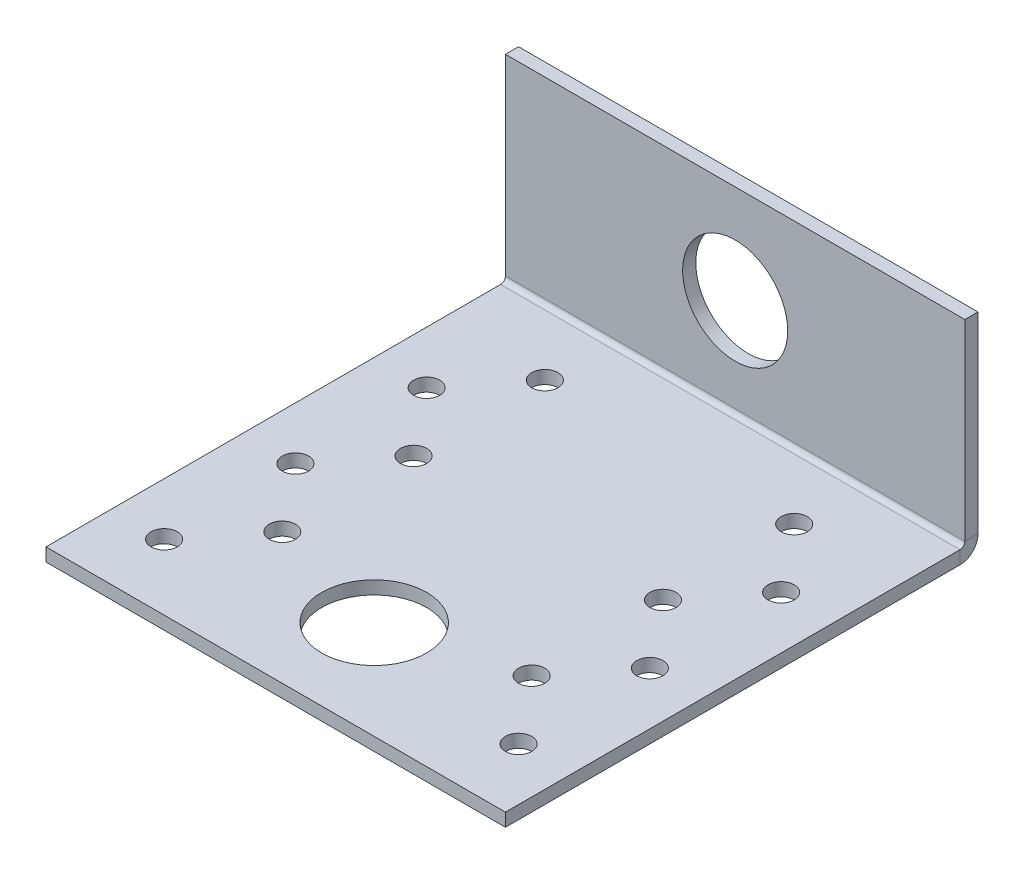
ISO-10303-21;
HEADER;
FILE_DESCRIPTION(('STEP AP214'),'2;1');
FILE_NAME('part.step','',(''),(''),'','','');
FILE_SCHEMA(('AUTOMOTIVE_DESIGN { 1 0 10303 214 1 1 1 1 }'));
ENDSEC;
DATA;
#1=APPLICATION_CONTEXT('core data for automotive mechanical design processes');
#2=APPLICATION_PROTOCOL_DEFINITION('international standard','automotive_design',2000,#1);
#3=PRODUCT_CONTEXT('',#1,'mechanical');
#4=PRODUCT('Part','Part','',(#3));
#5=PRODUCT_RELATED_PRODUCT_CATEGORY('part','',(#4));
#6=PRODUCT_DEFINITION_FORMATION('','',#4);
#7=PRODUCT_DEFINITION_CONTEXT('part definition',#1,'design');
#8=PRODUCT_DEFINITION('design','',#6,#7);
#9=PRODUCT_DEFINITION_SHAPE('','',#8);
#10=(LENGTH_UNIT() NAMED_UNIT(*) SI_UNIT(.MILLI.,.METRE.));
#11=(NAMED_UNIT(*) PLANE_ANGLE_UNIT() SI_UNIT($,.RADIAN.));
#12=(NAMED_UNIT(*) SI_UNIT($,.STERADIAN.) SOLID_ANGLE_UNIT());
#13=UNCERTAINTY_MEASURE_WITH_UNIT(LENGTH_MEASURE(1.E-05),#10,'distance_accuracy_value','');
#14=(GEOMETRIC_REPRESENTATION_CONTEXT(3) GLOBAL_UNCERTAINTY_ASSIGNED_CONTEXT((#13)) GLOBAL_UNIT_ASSIGNED_CONTEXT((#10,
#11,#12)) REPRESENTATION_CONTEXT('',''));
#15=CARTESIAN_POINT('',(0.,0.,0.));
#16=DIRECTION('',(0.,0.,1.));
#17=DIRECTION('',(1.,0.,0.));
#18=AXIS2_PLACEMENT_3D('',#15,#16,#17);
#19=CARTESIAN_POINT('',(-35.,-2.,-35.));
#20=DIRECTION('',(-1.,0.,0.));
#21=DIRECTION('',(0.,0.,1.));
#22=AXIS2_PLACEMENT_3D('',#19,#20,#21);
#23=PLANE('',#22);
#24=DIRECTION('',(0.,0.,1.));
#25=VECTOR('',#24,1.);
#26=CARTESIAN_POINT('',(-35.,0.,-35.));
#27=LINE('',#26,#25);
#28=CARTESIAN_POINT('',(-35.,0.,-34.2634));
#29=VERTEX_POINT('',#28);
#30=CARTESIAN_POINT('',(-35.,0.,35.));
#31=VERTEX_POINT('',#30);
#32=EDGE_CURVE('E90',#29,#31,#27,.T.);
#33=ORIENTED_EDGE('',*,*,#32,.F.);
#34=DIRECTION('',(0.,-1.,0.));
#35=VECTOR('',#34,1.);
#36=CARTESIAN_POINT('',(-35.,0.,-34.2634));
#37=LINE('',#36,#35);
#38=CARTESIAN_POINT('',(-35.,-2.00000000000001,-34.2634));
#39=VERTEX_POINT('',#38);
#40=EDGE_CURVE('E191',#29,#39,#37,.T.);
#41=ORIENTED_EDGE('',*,*,#40,.T.);
#42=DIRECTION('',(0.,0.,1.));
#43=VECTOR('',#42,1.);
#44=CARTESIAN_POINT('',(-35.,-2.,-35.));
#45=LINE('',#44,#43);
#46=CARTESIAN_POINT('',(-35.,-2.,35.));
#47=VERTEX_POINT('',#46);
#48=EDGE_CURVE('E92',#39,#47,#45,.T.);
#49=ORIENTED_EDGE('',*,*,#48,.T.);
#50=DIRECTION('',(0.,1.,0.));
#51=VECTOR('',#50,1.);
#52=CARTESIAN_POINT('',(-35.,-2.,35.));
#53=LINE('',#52,#51);
#54=EDGE_CURVE('E51',#47,#31,#53,.T.);
#55=ORIENTED_EDGE('',*,*,#54,.T.);
#56=EDGE_LOOP('',(#33,#41,#49,#55));
#57=FACE_BOUND('',#56,.T.);
#58=ADVANCED_FACE('F45',(#57),#23,.T.);
#59=CARTESIAN_POINT('',(0.,-2.,0.));
#60=DIRECTION('',(0.,1.,0.));
#61=DIRECTION('',(0.,0.,1.));
#62=AXIS2_PLACEMENT_3D('',#59,#60,#61);
#63=PLANE('',#62);
#64=CARTESIAN_POINT('',(-19.,-2.,-4.99999999999999));
#65=DIRECTION('',(0.,-1.,0.));
#66=DIRECTION('',(0.,0.,-1.));
#67=AXIS2_PLACEMENT_3D('',#64,#65,#66);
#68=CIRCLE('',#67,2.);
#69=CARTESIAN_POINT('',(-19.,-2.,-6.99999999999999));
#70=VERTEX_POINT('',#69);
#71=EDGE_CURVE('E333',#70,#70,#68,.T.);
#72=ORIENTED_EDGE('',*,*,#71,.F.);
#73=EDGE_LOOP('',(#72));
#74=FACE_BOUND('',#73,.T.);
#75=CARTESIAN_POINT('',(-27.,-2.,-15.));
#76=DIRECTION('',(0.,-1.,0.));
#77=DIRECTION('',(0.,0.,-1.));
#78=AXIS2_PLACEMENT_3D('',#75,#76,#77);
#79=CIRCLE('',#78,2.);
#80=CARTESIAN_POINT('',(-27.,-2.,-17.));
#81=VERTEX_POINT('',#80);
#82=EDGE_CURVE('E328',#81,#81,#79,.T.);
#83=ORIENTED_EDGE('',*,*,#82,.F.);
#84=EDGE_LOOP('',(#83));
#85=FACE_BOUND('',#84,.T.);
#86=CARTESIAN_POINT('',(-19.,-2.,-25.));
#87=DIRECTION('',(0.,-1.,0.));
#88=DIRECTION('',(0.,0.,-1.));
#89=AXIS2_PLACEMENT_3D('',#86,#87,#88);
#90=CIRCLE('',#89,2.);
#91=CARTESIAN_POINT('',(-19.,-2.,-27.));
#92=VERTEX_POINT('',#91);
#93=EDGE_CURVE('E344',#92,#92,#90,.T.);
#94=ORIENTED_EDGE('',*,*,#93,.F.);
#95=EDGE_LOOP('',(#94));
#96=FACE_BOUND('',#95,.T.);
#97=CARTESIAN_POINT('',(19.,-2.,15.));
#98=DIRECTION('',(0.,-1.,0.));
#99=DIRECTION('',(0.,0.,1.));
#100=AXIS2_PLACEMENT_3D('',#97,#98,#99);
#101=CIRCLE('',#100,2.);
#102=CARTESIAN_POINT('',(19.,-2.,17.));
#103=VERTEX_POINT('',#102);
#104=EDGE_CURVE('E345',#103,#103,#101,.T.);
#105=ORIENTED_EDGE('',*,*,#104,.F.);
#106=EDGE_LOOP('',(#105));
#107=FACE_BOUND('',#106,.T.);
#108=CARTESIAN_POINT('',(-27.,-2.,5.00000000000001));
#109=DIRECTION('',(0.,-1.,0.));
#110=DIRECTION('',(0.,0.,-1.));
#111=AXIS2_PLACEMENT_3D('',#108,#109,#110);
#112=CIRCLE('',#111,2.);
#113=CARTESIAN_POINT('',(-27.,-2.,3.));
#114=VERTEX_POINT('',#113);
#115=EDGE_CURVE('E334',#114,#114,#112,.T.);
#116=ORIENTED_EDGE('',*,*,#115,.F.);
#117=EDGE_LOOP('',(#116));
#118=FACE_BOUND('',#117,.T.);
#119=CARTESIAN_POINT('',(27.,-2.,5.00000000000001));
#120=DIRECTION('',(0.,-1.,0.));
#121=DIRECTION('',(0.,0.,1.));
#122=AXIS2_PLACEMENT_3D('',#119,#120,#121);
#123=CIRCLE('',#122,2.);
#124=CARTESIAN_POINT('',(27.,-2.,7.00000000000001));
#125=VERTEX_POINT('',#124);
#126=EDGE_CURVE('E326',#125,#125,#123,.T.);
#127=ORIENTED_EDGE('',*,*,#126,.F.);
#128=EDGE_LOOP('',(#127));
#129=FACE_BOUND('',#128,.T.);
#130=CARTESIAN_POINT('',(-19.,-2.,15.));
#131=DIRECTION('',(0.,-1.,0.));
#132=DIRECTION('',(0.,0.,-1.));
#133=AXIS2_PLACEMENT_3D('',#130,#131,#132);
#134=CIRCLE('',#133,2.);
#135=CARTESIAN_POINT('',(-19.,-2.,13.));
#136=VERTEX_POINT('',#135);
#137=EDGE_CURVE('E321',#136,#136,#134,.T.);
#138=ORIENTED_EDGE('',*,*,#137,.F.);
#139=EDGE_LOOP('',(#138));
#140=FACE_BOUND('',#139,.T.);
#141=CARTESIAN_POINT('',(-27.,-2.,25.));
#142=DIRECTION('',(0.,-1.,0.));
#143=DIRECTION('',(0.,0.,-1.));
#144=AXIS2_PLACEMENT_3D('',#141,#142,#143);
#145=CIRCLE('',#144,2.00000000000001);
#146=CARTESIAN_POINT('',(-27.,-2.,23.));
#147=VERTEX_POINT('',#146);
#148=EDGE_CURVE('E317',#147,#147,#145,.T.);
#149=ORIENTED_EDGE('',*,*,#148,.F.);
#150=EDGE_LOOP('',(#149));
#151=FACE_BOUND('',#150,.T.);
#152=CARTESIAN_POINT('',(19.,-2.,-25.));
#153=DIRECTION('',(0.,-1.,0.));
#154=DIRECTION('',(0.,0.,1.));
#155=AXIS2_PLACEMENT_3D('',#152,#153,#154);
#156=CIRCLE('',#155,2.);
#157=CARTESIAN_POINT('',(19.,-2.,-23.));
#158=VERTEX_POINT('',#157);
#159=EDGE_CURVE('E350',#158,#158,#156,.T.);
#160=ORIENTED_EDGE('',*,*,#159,.F.);
#161=EDGE_LOOP('',(#160));
#162=FACE_BOUND('',#161,.T.);
#163=CARTESIAN_POINT('',(27.,-2.,-15.));
#164=DIRECTION('',(0.,-1.,0.));
#165=DIRECTION('',(0.,0.,1.));
#166=AXIS2_PLACEMENT_3D('',#163,#164,#165);
#167=CIRCLE('',#166,2.);
#168=CARTESIAN_POINT('',(27.,-2.,-13.));
#169=VERTEX_POINT('',#168);
#170=EDGE_CURVE('E358',#169,#169,#167,.T.);
#171=ORIENTED_EDGE('',*,*,#170,.F.);
#172=EDGE_LOOP('',(#171));
#173=FACE_BOUND('',#172,.T.);
#174=CARTESIAN_POINT('',(19.,-2.,-4.99999999999999));
#175=DIRECTION('',(0.,-1.,0.));
#176=DIRECTION('',(0.,0.,1.));
#177=AXIS2_PLACEMENT_3D('',#174,#175,#176);
#178=CIRCLE('',#177,2.);
#179=CARTESIAN_POINT('',(19.,-2.,-2.99999999999999));
#180=VERTEX_POINT('',#179);
#181=EDGE_CURVE('E351',#180,#180,#178,.T.);
#182=ORIENTED_EDGE('',*,*,#181,.F.);
#183=EDGE_LOOP('',(#182));
#184=FACE_BOUND('',#183,.T.);
#185=CARTESIAN_POINT('',(27.,-2.,25.));
#186=DIRECTION('',(0.,-1.,0.));
#187=DIRECTION('',(0.,0.,1.));
#188=AXIS2_PLACEMENT_3D('',#185,#186,#187);
#189=CIRCLE('',#188,2.00000000000001);
#190=CARTESIAN_POINT('',(27.,-2.,27.));
#191=VERTEX_POINT('',#190);
#192=EDGE_CURVE('E348',#191,#191,#189,.T.);
#193=ORIENTED_EDGE('',*,*,#192,.F.);
#194=EDGE_LOOP('',(#193));
#195=FACE_BOUND('',#194,.T.);
#196=CARTESIAN_POINT('',(0.,-2.,20.));
#197=DIRECTION('',(0.,-1.,0.));
#198=DIRECTION('',(0.,0.,-1.));
#199=AXIS2_PLACEMENT_3D('',#196,#197,#198);
#200=CIRCLE('',#199,8.);
#201=CARTESIAN_POINT('',(0.,-2.,12.));
#202=VERTEX_POINT('',#201);
#203=EDGE_CURVE('E102',#202,#202,#200,.T.);
#204=ORIENTED_EDGE('',*,*,#203,.F.);
#205=EDGE_LOOP('',(#204));
#206=FACE_BOUND('',#205,.T.);
#207=DIRECTION('',(-1.,0.,0.));
#208=VECTOR('',#207,1.);
#209=CARTESIAN_POINT('',(-35.,-2.00000000000001,-34.2634));
#210=LINE('',#209,#208);
#211=CARTESIAN_POINT('',(35.,-2.,-34.2634));
#212=VERTEX_POINT('',#211);
#213=EDGE_CURVE('E186',#39,#212,#210,.F.);
#214=ORIENTED_EDGE('',*,*,#213,.T.);
#215=DIRECTION('',(0.,0.,-1.));
#216=VECTOR('',#215,1.);
#217=CARTESIAN_POINT('',(35.,-2.,-35.));
#218=LINE('',#217,#216);
#219=CARTESIAN_POINT('',(35.,-2.,35.));
#220=VERTEX_POINT('',#219);
#221=EDGE_CURVE('E91',#220,#212,#218,.T.);
#222=ORIENTED_EDGE('',*,*,#221,.F.);
#223=DIRECTION('',(1.,0.,0.));
#224=VECTOR('',#223,1.);
#225=CARTESIAN_POINT('',(-35.,-2.,35.));
#226=LINE('',#225,#224);
#227=EDGE_CURVE('E82',#47,#220,#226,.T.);
#228=ORIENTED_EDGE('',*,*,#227,.F.);
#229=ORIENTED_EDGE('',*,*,#48,.F.);
#230=EDGE_LOOP('',(#214,#222,#228,#229));
#231=FACE_BOUND('',#230,.T.);
#232=ADVANCED_FACE('F212',(#74,#85,#96,#107,#118,#129,#140,#151,#162,#173,#184,#195,#206,#231),
#63,.F.);
#233=CARTESIAN_POINT('',(0.,0.,0.));
#234=DIRECTION('',(0.,1.,0.));
#235=DIRECTION('',(0.,0.,1.));
#236=AXIS2_PLACEMENT_3D('',#233,#234,#235);
#237=PLANE('',#236);
#238=CARTESIAN_POINT('',(-19.,0.,-4.99999999999999));
#239=DIRECTION('',(0.,1.,0.));
#240=DIRECTION('',(0.,0.,1.));
#241=AXIS2_PLACEMENT_3D('',#238,#239,#240);
#242=CIRCLE('',#241,2.);
#243=CARTESIAN_POINT('',(-19.,0.,-2.99999999999999));
#244=VERTEX_POINT('',#243);
#245=EDGE_CURVE('E46',#244,#244,#242,.T.);
#246=ORIENTED_EDGE('',*,*,#245,.F.);
#247=EDGE_LOOP('',(#246));
#248=FACE_BOUND('',#247,.T.);
#249=CARTESIAN_POINT('',(-27.,0.,-15.));
#250=DIRECTION('',(0.,1.,0.));
#251=DIRECTION('',(0.,0.,1.));
#252=AXIS2_PLACEMENT_3D('',#249,#250,#251);
#253=CIRCLE('',#252,2.);
#254=CARTESIAN_POINT('',(-27.,0.,-13.));
#255=VERTEX_POINT('',#254);
#256=EDGE_CURVE('E131',#255,#255,#253,.T.);
#257=ORIENTED_EDGE('',*,*,#256,.F.);
#258=EDGE_LOOP('',(#257));
#259=FACE_BOUND('',#258,.T.);
#260=CARTESIAN_POINT('',(-19.,0.,-25.));
#261=DIRECTION('',(0.,1.,0.));
#262=DIRECTION('',(0.,0.,1.));
#263=AXIS2_PLACEMENT_3D('',#260,#261,#262);
#264=CIRCLE('',#263,2.);
#265=CARTESIAN_POINT('',(-19.,0.,-23.));
#266=VERTEX_POINT('',#265);
#267=EDGE_CURVE('E133',#266,#266,#264,.T.);
#268=ORIENTED_EDGE('',*,*,#267,.F.);
#269=EDGE_LOOP('',(#268));
#270=FACE_BOUND('',#269,.T.);
#271=CARTESIAN_POINT('',(19.,0.,15.));
#272=DIRECTION('',(0.,1.,0.));
#273=DIRECTION('',(0.,0.,1.));
#274=AXIS2_PLACEMENT_3D('',#271,#272,#273);
#275=CIRCLE('',#274,2.);
#276=CARTESIAN_POINT('',(19.,0.,17.));
#277=VERTEX_POINT('',#276);
#278=EDGE_CURVE('E126',#277,#277,#275,.T.);
#279=ORIENTED_EDGE('',*,*,#278,.F.);
#280=EDGE_LOOP('',(#279));
#281=FACE_BOUND('',#280,.T.);
#282=CARTESIAN_POINT('',(-27.,0.,5.00000000000001));
#283=DIRECTION('',(0.,1.,0.));
#284=DIRECTION('',(0.,0.,1.));
#285=AXIS2_PLACEMENT_3D('',#282,#283,#284);
#286=CIRCLE('',#285,2.);
#287=CARTESIAN_POINT('',(-27.,0.,7.00000000000001));
#288=VERTEX_POINT('',#287);
#289=EDGE_CURVE('E121',#288,#288,#286,.T.);
#290=ORIENTED_EDGE('',*,*,#289,.F.);
#291=EDGE_LOOP('',(#290));
#292=FACE_BOUND('',#291,.T.);
#293=CARTESIAN_POINT('',(27.,0.,5.00000000000001));
#294=DIRECTION('',(0.,1.,0.));
#295=DIRECTION('',(0.,0.,1.));
#296=AXIS2_PLACEMENT_3D('',#293,#294,#295);
#297=CIRCLE('',#296,2.);
#298=CARTESIAN_POINT('',(27.,0.,7.00000000000001));
#299=VERTEX_POINT('',#298);
#300=EDGE_CURVE('E124',#299,#299,#297,.T.);
#301=ORIENTED_EDGE('',*,*,#300,.F.);
#302=EDGE_LOOP('',(#301));
#303=FACE_BOUND('',#302,.T.);
#304=CARTESIAN_POINT('',(-19.,0.,15.));
#305=DIRECTION('',(0.,1.,0.));
#306=DIRECTION('',(0.,0.,1.));
#307=AXIS2_PLACEMENT_3D('',#304,#305,#306);
#308=CIRCLE('',#307,2.);
#309=CARTESIAN_POINT('',(-19.,0.,17.));
#310=VERTEX_POINT('',#309);
#311=EDGE_CURVE('E116',#310,#310,#308,.T.);
#312=ORIENTED_EDGE('',*,*,#311,.F.);
#313=EDGE_LOOP('',(#312));
#314=FACE_BOUND('',#313,.T.);
#315=CARTESIAN_POINT('',(-27.,0.,25.));
#316=DIRECTION('',(0.,1.,0.));
#317=DIRECTION('',(0.,0.,1.));
#318=AXIS2_PLACEMENT_3D('',#315,#316,#317);
#319=CIRCLE('',#318,2.00000000000001);
#320=CARTESIAN_POINT('',(-27.,0.,27.));
#321=VERTEX_POINT('',#320);
#322=EDGE_CURVE('E117',#321,#321,#319,.T.);
#323=ORIENTED_EDGE('',*,*,#322,.F.);
#324=EDGE_LOOP('',(#323));
#325=FACE_BOUND('',#324,.T.);
#326=CARTESIAN_POINT('',(19.,0.,-25.));
#327=DIRECTION('',(0.,1.,0.));
#328=DIRECTION('',(0.,0.,1.));
#329=AXIS2_PLACEMENT_3D('',#326,#327,#328);
#330=CIRCLE('',#329,2.);
#331=CARTESIAN_POINT('',(19.,0.,-23.));
#332=VERTEX_POINT('',#331);
#333=EDGE_CURVE('E114',#332,#332,#330,.T.);
#334=ORIENTED_EDGE('',*,*,#333,.F.);
#335=EDGE_LOOP('',(#334));
#336=FACE_BOUND('',#335,.T.);
#337=CARTESIAN_POINT('',(27.,0.,-15.));
#338=DIRECTION('',(0.,1.,0.));
#339=DIRECTION('',(0.,0.,1.));
#340=AXIS2_PLACEMENT_3D('',#337,#338,#339);
#341=CIRCLE('',#340,2.);
#342=CARTESIAN_POINT('',(27.,0.,-13.));
#343=VERTEX_POINT('',#342);
#344=EDGE_CURVE('E109',#343,#343,#341,.T.);
#345=ORIENTED_EDGE('',*,*,#344,.F.);
#346=EDGE_LOOP('',(#345));
#347=FACE_BOUND('',#346,.T.);
#348=CARTESIAN_POINT('',(19.,0.,-4.99999999999999));
#349=DIRECTION('',(0.,1.,0.));
#350=DIRECTION('',(0.,0.,1.));
#351=AXIS2_PLACEMENT_3D('',#348,#349,#350);
#352=CIRCLE('',#351,2.);
#353=CARTESIAN_POINT('',(19.,0.,-2.99999999999999));
#354=VERTEX_POINT('',#353);
#355=EDGE_CURVE('E110',#354,#354,#352,.T.);
#356=ORIENTED_EDGE('',*,*,#355,.F.);
#357=EDGE_LOOP('',(#356));
#358=FACE_BOUND('',#357,.T.);
#359=CARTESIAN_POINT('',(27.,0.,25.));
#360=DIRECTION('',(0.,1.,0.));
#361=DIRECTION('',(0.,0.,1.));
#362=AXIS2_PLACEMENT_3D('',#359,#360,#361);
#363=CIRCLE('',#362,2.00000000000001);
#364=CARTESIAN_POINT('',(27.,0.,27.));
#365=VERTEX_POINT('',#364);
#366=EDGE_CURVE('E103',#365,#365,#363,.T.);
#367=ORIENTED_EDGE('',*,*,#366,.F.);
#368=EDGE_LOOP('',(#367));
#369=FACE_BOUND('',#368,.T.);
#370=CARTESIAN_POINT('',(0.,0.,20.));
#371=DIRECTION('',(0.,1.,0.));
#372=DIRECTION('',(0.,0.,1.));
#373=AXIS2_PLACEMENT_3D('',#370,#371,#372);
#374=CIRCLE('',#373,8.);
#375=CARTESIAN_POINT('',(0.,0.,28.));
#376=VERTEX_POINT('',#375);
#377=EDGE_CURVE('E99',#376,#376,#374,.T.);
#378=ORIENTED_EDGE('',*,*,#377,.F.);
#379=EDGE_LOOP('',(#378));
#380=FACE_BOUND('',#379,.T.);
#381=DIRECTION('',(0.,0.,-1.));
#382=VECTOR('',#381,1.);
#383=CARTESIAN_POINT('',(35.,0.,-35.));
#384=LINE('',#383,#382);
#385=CARTESIAN_POINT('',(35.,0.,35.));
#386=VERTEX_POINT('',#385);
#387=CARTESIAN_POINT('',(35.,0.,-34.2634));
#388=VERTEX_POINT('',#387);
#389=EDGE_CURVE('E81',#386,#388,#384,.T.);
#390=ORIENTED_EDGE('',*,*,#389,.T.);
#391=DIRECTION('',(-1.,0.,0.));
#392=VECTOR('',#391,1.);
#393=CARTESIAN_POINT('',(-35.,0.,-34.2634));
#394=LINE('',#393,#392);
#395=EDGE_CURVE('E56',#29,#388,#394,.F.);
#396=ORIENTED_EDGE('',*,*,#395,.F.);
#397=ORIENTED_EDGE('',*,*,#32,.T.);
#398=DIRECTION('',(1.,0.,0.));
#399=VECTOR('',#398,1.);
#400=CARTESIAN_POINT('',(-35.,0.,35.));
#401=LINE('',#400,#399);
#402=EDGE_CURVE('E83',#31,#386,#401,.T.);
#403=ORIENTED_EDGE('',*,*,#402,.T.);
#404=EDGE_LOOP('',(#390,#396,#397,#403));
#405=FACE_BOUND('',#404,.T.);
#406=ADVANCED_FACE('F93',(#248,#259,#270,#281,#292,#303,#314,#325,#336,#347,#358,#369,#380,
#405),#237,.T.);
#407=CARTESIAN_POINT('',(35.,-2.,-35.));
#408=DIRECTION('',(1.,0.,0.));
#409=DIRECTION('',(0.,0.,-1.));
#410=AXIS2_PLACEMENT_3D('',#407,#408,#409);
#411=PLANE('',#410);
#412=DIRECTION('',(0.,-1.,0.));
#413=VECTOR('',#412,1.);
#414=CARTESIAN_POINT('',(35.,0.,-34.2634));
#415=LINE('',#414,#413);
#416=EDGE_CURVE('E86',#388,#212,#415,.T.);
#417=ORIENTED_EDGE('',*,*,#416,.F.);
#418=ORIENTED_EDGE('',*,*,#389,.F.);
#419=DIRECTION('',(0.,1.,0.));
#420=VECTOR('',#419,1.);
#421=CARTESIAN_POINT('',(35.,-2.,35.));
#422=LINE('',#421,#420);
#423=EDGE_CURVE('E11',#220,#386,#422,.T.);
#424=ORIENTED_EDGE('',*,*,#423,.F.);
#425=ORIENTED_EDGE('',*,*,#221,.T.);
#426=EDGE_LOOP('',(#417,#418,#424,#425));
#427=FACE_BOUND('',#426,.T.);
#428=ADVANCED_FACE('F42',(#427),#411,.T.);
#429=CARTESIAN_POINT('',(-35.,-2.,35.));
#430=DIRECTION('',(0.,0.,1.));
#431=DIRECTION('',(1.,0.,0.));
#432=AXIS2_PLACEMENT_3D('',#429,#430,#431);
#433=PLANE('',#432);
#434=ORIENTED_EDGE('',*,*,#402,.F.);
#435=ORIENTED_EDGE('',*,*,#54,.F.);
#436=ORIENTED_EDGE('',*,*,#227,.T.);
#437=ORIENTED_EDGE('',*,*,#423,.T.);
#438=EDGE_LOOP('',(#434,#435,#436,#437));
#439=FACE_BOUND('',#438,.T.);
#440=ADVANCED_FACE('F76',(#439),#433,.T.);
#441=CARTESIAN_POINT('',(35.,0.736599999999992,-34.2634));
#442=DIRECTION('',(1.,0.,0.));
#443=DIRECTION('',(0.,0.,-1.));
#444=AXIS2_PLACEMENT_3D('',#441,#442,#443);
#445=PLANE('',#444);
#446=DIRECTION('',(0.,0.,-1.));
#447=VECTOR('',#446,1.);
#448=CARTESIAN_POINT('',(35.,0.736599999999997,-35.));
#449=LINE('',#448,#447);
#450=CARTESIAN_POINT('',(35.,0.736599999999989,-35.));
#451=VERTEX_POINT('',#450);
#452=CARTESIAN_POINT('',(35.,0.736599999999982,-37.));
#453=VERTEX_POINT('',#452);
#454=EDGE_CURVE('E150',#451,#453,#449,.T.);
#455=ORIENTED_EDGE('',*,*,#454,.F.);
#456=CARTESIAN_POINT('',(35.,0.736599999999992,-34.2634));
#457=DIRECTION('',(-1.,0.,0.));
#458=DIRECTION('',(0.,0.,1.));
#459=AXIS2_PLACEMENT_3D('',#456,#457,#458);
#460=CIRCLE('',#459,0.736599999999997);
#461=EDGE_CURVE('E196',#388,#451,#460,.F.);
#462=ORIENTED_EDGE('',*,*,#461,.F.);
#463=ORIENTED_EDGE('',*,*,#416,.T.);
#464=CARTESIAN_POINT('',(35.,0.736599999999992,-34.2634));
#465=DIRECTION('',(-1.,0.,0.));
#466=DIRECTION('',(0.,0.,1.));
#467=AXIS2_PLACEMENT_3D('',#464,#465,#466);
#468=CIRCLE('',#467,2.7366);
#469=EDGE_CURVE('E193',#212,#453,#468,.F.);
#470=ORIENTED_EDGE('',*,*,#469,.T.);
#471=EDGE_LOOP('',(#455,#462,#463,#470));
#472=FACE_BOUND('',#471,.T.);
#473=ADVANCED_FACE('F218',(#472),#445,.T.);
#474=CARTESIAN_POINT('',(-35.,0.736599999999992,-34.2634));
#475=DIRECTION('',(1.,0.,0.));
#476=DIRECTION('',(0.,0.,-1.));
#477=AXIS2_PLACEMENT_3D('',#474,#475,#476);
#478=PLANE('',#477);
#479=CARTESIAN_POINT('',(-35.,0.736599999999992,-34.2634));
#480=DIRECTION('',(-1.,0.,0.));
#481=DIRECTION('',(0.,0.,1.));
#482=AXIS2_PLACEMENT_3D('',#479,#480,#481);
#483=CIRCLE('',#482,0.736599999999997);
#484=CARTESIAN_POINT('',(-35.,0.736599999999989,-35.));
#485=VERTEX_POINT('',#484);
#486=EDGE_CURVE('E190',#485,#29,#483,.T.);
#487=ORIENTED_EDGE('',*,*,#486,.F.);
#488=DIRECTION('',(0.,0.,-1.));
#489=VECTOR('',#488,1.);
#490=CARTESIAN_POINT('',(-35.,0.736599999999997,-35.));
#491=LINE('',#490,#489);
#492=CARTESIAN_POINT('',(-35.,0.736600000000011,-37.));
#493=VERTEX_POINT('',#492);
#494=EDGE_CURVE('E154',#485,#493,#491,.T.);
#495=ORIENTED_EDGE('',*,*,#494,.T.);
#496=CARTESIAN_POINT('',(-35.,0.736599999999992,-34.2634));
#497=DIRECTION('',(-1.,0.,0.));
#498=DIRECTION('',(0.,0.,1.));
#499=AXIS2_PLACEMENT_3D('',#496,#497,#498);
#500=CIRCLE('',#499,2.7366);
#501=EDGE_CURVE('E194',#493,#39,#500,.T.);
#502=ORIENTED_EDGE('',*,*,#501,.T.);
#503=ORIENTED_EDGE('',*,*,#40,.F.);
#504=EDGE_LOOP('',(#487,#495,#502,#503));
#505=FACE_BOUND('',#504,.T.);
#506=ADVANCED_FACE('F263',(#505),#478,.F.);
#507=CARTESIAN_POINT('',(-35.,0.736599999999992,-34.2634));
#508=DIRECTION('',(-1.,0.,0.));
#509=DIRECTION('',(0.,0.,-1.));
#510=AXIS2_PLACEMENT_3D('',#507,#508,#509);
#511=CYLINDRICAL_SURFACE('',#510,2.7366);
#512=ORIENTED_EDGE('',*,*,#213,.F.);
#513=ORIENTED_EDGE('',*,*,#501,.F.);
#514=DIRECTION('',(1.,0.,0.));
#515=VECTOR('',#514,1.);
#516=CARTESIAN_POINT('',(0.,0.736600000000011,-37.));
#517=LINE('',#516,#515);
#518=EDGE_CURVE('E158',#493,#453,#517,.T.);
#519=ORIENTED_EDGE('',*,*,#518,.T.);
#520=ORIENTED_EDGE('',*,*,#469,.F.);
#521=EDGE_LOOP('',(#512,#513,#519,#520));
#522=FACE_BOUND('',#521,.T.);
#523=ADVANCED_FACE('F225',(#522),#511,.T.);
#524=CARTESIAN_POINT('',(-35.,0.736599999999992,-34.2634));
#525=DIRECTION('',(-1.,0.,0.));
#526=DIRECTION('',(0.,0.,-1.));
#527=AXIS2_PLACEMENT_3D('',#524,#525,#526);
#528=CYLINDRICAL_SURFACE('',#527,0.736599999999997);
#529=ORIENTED_EDGE('',*,*,#395,.T.);
#530=ORIENTED_EDGE('',*,*,#461,.T.);
#531=DIRECTION('',(-1.,0.,0.));
#532=VECTOR('',#531,1.);
#533=CARTESIAN_POINT('',(35.,0.736599999999997,-35.));
#534=LINE('',#533,#532);
#535=EDGE_CURVE('E155',#451,#485,#534,.T.);
#536=ORIENTED_EDGE('',*,*,#535,.T.);
#537=ORIENTED_EDGE('',*,*,#486,.T.);
#538=EDGE_LOOP('',(#529,#530,#536,#537));
#539=FACE_BOUND('',#538,.T.);
#540=ADVANCED_FACE('F259',(#539),#528,.F.);
#541=CARTESIAN_POINT('',(35.,0.,-37.));
#542=DIRECTION('',(-1.,0.,0.));
#543=DIRECTION('',(0.,0.,1.));
#544=AXIS2_PLACEMENT_3D('',#541,#542,#543);
#545=PLANE('',#544);
#546=ORIENTED_EDGE('',*,*,#454,.T.);
#547=DIRECTION('',(0.,-1.,0.));
#548=VECTOR('',#547,1.);
#549=CARTESIAN_POINT('',(35.,0.,-37.));
#550=LINE('',#549,#548);
#551=CARTESIAN_POINT('',(35.,30.,-37.0000000000001));
#552=VERTEX_POINT('',#551);
#553=EDGE_CURVE('E163',#552,#453,#550,.T.);
#554=ORIENTED_EDGE('',*,*,#553,.F.);
#555=DIRECTION('',(0.,0.,1.));
#556=VECTOR('',#555,1.);
#557=CARTESIAN_POINT('',(35.,30.,-37.0000000000001));
#558=LINE('',#557,#556);
#559=CARTESIAN_POINT('',(35.,30.,-35.0000000000001));
#560=VERTEX_POINT('',#559);
#561=EDGE_CURVE('E171',#552,#560,#558,.T.);
#562=ORIENTED_EDGE('',*,*,#561,.T.);
#563=DIRECTION('',(0.,-1.,0.));
#564=VECTOR('',#563,1.);
#565=CARTESIAN_POINT('',(35.,0.,-35.));
#566=LINE('',#565,#564);
#567=EDGE_CURVE('E162',#560,#451,#566,.T.);
#568=ORIENTED_EDGE('',*,*,#567,.T.);
#569=EDGE_LOOP('',(#546,#554,#562,#568));
#570=FACE_BOUND('',#569,.T.);
#571=ADVANCED_FACE('F426',(#570),#545,.F.);
#572=CARTESIAN_POINT('',(-35.,30.,-37.0000000000001));
#573=DIRECTION('',(1.,0.,0.));
#574=DIRECTION('',(0.,0.,-1.));
#575=AXIS2_PLACEMENT_3D('',#572,#573,#574);
#576=PLANE('',#575);
#577=ORIENTED_EDGE('',*,*,#494,.F.);
#578=DIRECTION('',(0.,1.,0.));
#579=VECTOR('',#578,1.);
#580=CARTESIAN_POINT('',(-35.,30.,-35.0000000000001));
#581=LINE('',#580,#579);
#582=CARTESIAN_POINT('',(-35.,30.,-35.0000000000001));
#583=VERTEX_POINT('',#582);
#584=EDGE_CURVE('E179',#485,#583,#581,.T.);
#585=ORIENTED_EDGE('',*,*,#584,.T.);
#586=DIRECTION('',(0.,0.,1.));
#587=VECTOR('',#586,1.);
#588=CARTESIAN_POINT('',(-35.,30.,-37.0000000000001));
#589=LINE('',#588,#587);
#590=CARTESIAN_POINT('',(-35.,30.,-37.0000000000001));
#591=VERTEX_POINT('',#590);
#592=EDGE_CURVE('E184',#591,#583,#589,.T.);
#593=ORIENTED_EDGE('',*,*,#592,.F.);
#594=DIRECTION('',(0.,1.,0.));
#595=VECTOR('',#594,1.);
#596=CARTESIAN_POINT('',(-35.,30.,-37.0000000000001));
#597=LINE('',#596,#595);
#598=EDGE_CURVE('E170',#493,#591,#597,.T.);
#599=ORIENTED_EDGE('',*,*,#598,.F.);
#600=EDGE_LOOP('',(#577,#585,#593,#599));
#601=FACE_BOUND('',#600,.T.);
#602=ADVANCED_FACE('F236',(#601),#576,.F.);
#603=CARTESIAN_POINT('',(0.,-1.28413605996063E-13,-37.));
#604=DIRECTION('',(0.,0.,1.));
#605=DIRECTION('',(0.,-1.,0.));
#606=AXIS2_PLACEMENT_3D('',#603,#604,#605);
#607=PLANE('',#606);
#608=CARTESIAN_POINT('',(0.,15.,-37.));
#609=DIRECTION('',(0.,0.,1.));
#610=DIRECTION('',(0.,-1.,0.));
#611=AXIS2_PLACEMENT_3D('',#608,#609,#610);
#612=CIRCLE('',#611,8.);
#613=CARTESIAN_POINT('',(0.,7.00000000000002,-37.));
#614=VERTEX_POINT('',#613);
#615=EDGE_CURVE('E142',#614,#614,#612,.T.);
#616=ORIENTED_EDGE('',*,*,#615,.T.);
#617=EDGE_LOOP('',(#616));
#618=FACE_BOUND('',#617,.T.);
#619=ORIENTED_EDGE('',*,*,#518,.F.);
#620=ORIENTED_EDGE('',*,*,#598,.T.);
#621=DIRECTION('',(1.,0.,0.));
#622=VECTOR('',#621,1.);
#623=CARTESIAN_POINT('',(35.,30.,-37.0000000000001));
#624=LINE('',#623,#622);
#625=EDGE_CURVE('E172',#591,#552,#624,.T.);
#626=ORIENTED_EDGE('',*,*,#625,.T.);
#627=ORIENTED_EDGE('',*,*,#553,.T.);
#628=EDGE_LOOP('',(#619,#620,#626,#627));
#629=FACE_BOUND('',#628,.T.);
#630=ADVANCED_FACE('F228',(#618,#629),#607,.F.);
#631=CARTESIAN_POINT('',(0.,-1.21430643318376E-13,-35.));
#632=DIRECTION('',(0.,0.,1.));
#633=DIRECTION('',(0.,-1.,0.));
#634=AXIS2_PLACEMENT_3D('',#631,#632,#633);
#635=PLANE('',#634);
#636=CARTESIAN_POINT('',(0.,15.,-35.));
#637=DIRECTION('',(0.,0.,1.));
#638=DIRECTION('',(1.,0.,0.));
#639=AXIS2_PLACEMENT_3D('',#636,#637,#638);
#640=CIRCLE('',#639,8.);
#641=CARTESIAN_POINT('',(8.,15.,-35.));
#642=VERTEX_POINT('',#641);
#643=EDGE_CURVE('E137',#642,#642,#640,.T.);
#644=ORIENTED_EDGE('',*,*,#643,.F.);
#645=EDGE_LOOP('',(#644));
#646=FACE_BOUND('',#645,.T.);
#647=ORIENTED_EDGE('',*,*,#584,.F.);
#648=ORIENTED_EDGE('',*,*,#535,.F.);
#649=ORIENTED_EDGE('',*,*,#567,.F.);
#650=DIRECTION('',(1.,0.,0.));
#651=VECTOR('',#650,1.);
#652=CARTESIAN_POINT('',(35.,30.,-35.0000000000001));
#653=LINE('',#652,#651);
#654=EDGE_CURVE('E169',#583,#560,#653,.T.);
#655=ORIENTED_EDGE('',*,*,#654,.F.);
#656=EDGE_LOOP('',(#647,#648,#649,#655));
#657=FACE_BOUND('',#656,.T.);
#658=ADVANCED_FACE('F417',(#646,#657),#635,.T.);
#659=CARTESIAN_POINT('',(35.,30.,-37.0000000000001));
#660=DIRECTION('',(0.,-1.,0.));
#661=DIRECTION('',(0.,0.,-1.));
#662=AXIS2_PLACEMENT_3D('',#659,#660,#661);
#663=PLANE('',#662);
#664=ORIENTED_EDGE('',*,*,#654,.T.);
#665=ORIENTED_EDGE('',*,*,#561,.F.);
#666=ORIENTED_EDGE('',*,*,#625,.F.);
#667=ORIENTED_EDGE('',*,*,#592,.T.);
#668=EDGE_LOOP('',(#664,#665,#666,#667));
#669=FACE_BOUND('',#668,.T.);
#670=ADVANCED_FACE('F249',(#669),#663,.F.);
#671=CARTESIAN_POINT('',(0.,15.,-45.));
#672=DIRECTION('',(0.,0.,1.));
#673=DIRECTION('',(1.,0.,0.));
#674=AXIS2_PLACEMENT_3D('',#671,#672,#673);
#675=CYLINDRICAL_SURFACE('',#674,8.);
#676=ORIENTED_EDGE('',*,*,#643,.T.);
#677=EDGE_LOOP('',(#676));
#678=FACE_BOUND('',#677,.T.);
#679=ORIENTED_EDGE('',*,*,#615,.F.);
#680=EDGE_LOOP('',(#679));
#681=FACE_BOUND('',#680,.T.);
#682=ADVANCED_FACE('F314',(#678,#681),#675,.F.);
#683=CARTESIAN_POINT('',(0.,8.,20.));
#684=DIRECTION('',(0.,-1.,0.));
#685=DIRECTION('',(0.,0.,-1.));
#686=AXIS2_PLACEMENT_3D('',#683,#684,#685);
#687=CYLINDRICAL_SURFACE('',#686,8.);
#688=ORIENTED_EDGE('',*,*,#377,.T.);
#689=EDGE_LOOP('',(#688));
#690=FACE_BOUND('',#689,.T.);
#691=ORIENTED_EDGE('',*,*,#203,.T.);
#692=EDGE_LOOP('',(#691));
#693=FACE_BOUND('',#692,.T.);
#694=ADVANCED_FACE('F313',(#690,#693),#687,.F.);
#695=CARTESIAN_POINT('',(27.,8.,25.));
#696=DIRECTION('',(0.,-1.,0.));
#697=DIRECTION('',(0.,0.,-1.));
#698=AXIS2_PLACEMENT_3D('',#695,#696,#697);
#699=CYLINDRICAL_SURFACE('',#698,2.00000000000001);
#700=ORIENTED_EDGE('',*,*,#366,.T.);
#701=EDGE_LOOP('',(#700));
#702=FACE_BOUND('',#701,.T.);
#703=ORIENTED_EDGE('',*,*,#192,.T.);
#704=EDGE_LOOP('',(#703));
#705=FACE_BOUND('',#704,.T.);
#706=ADVANCED_FACE('F311',(#702,#705),#699,.F.);
#707=CARTESIAN_POINT('',(19.,8.,-4.99999999999999));
#708=DIRECTION('',(0.,-1.,0.));
#709=DIRECTION('',(0.,0.,-1.));
#710=AXIS2_PLACEMENT_3D('',#707,#708,#709);
#711=CYLINDRICAL_SURFACE('',#710,2.);
#712=ORIENTED_EDGE('',*,*,#355,.T.);
#713=EDGE_LOOP('',(#712));
#714=FACE_BOUND('',#713,.T.);
#715=ORIENTED_EDGE('',*,*,#181,.T.);
#716=EDGE_LOOP('',(#715));
#717=FACE_BOUND('',#716,.T.);
#718=ADVANCED_FACE('F375',(#714,#717),#711,.F.);
#719=CARTESIAN_POINT('',(27.,8.,-15.));
#720=DIRECTION('',(0.,-1.,0.));
#721=DIRECTION('',(0.,0.,-1.));
#722=AXIS2_PLACEMENT_3D('',#719,#720,#721);
#723=CYLINDRICAL_SURFACE('',#722,2.);
#724=ORIENTED_EDGE('',*,*,#344,.T.);
#725=EDGE_LOOP('',(#724));
#726=FACE_BOUND('',#725,.T.);
#727=ORIENTED_EDGE('',*,*,#170,.T.);
#728=EDGE_LOOP('',(#727));
#729=FACE_BOUND('',#728,.T.);
#730=ADVANCED_FACE('F378',(#726,#729),#723,.F.);
#731=CARTESIAN_POINT('',(19.,8.,-25.));
#732=DIRECTION('',(0.,-1.,0.));
#733=DIRECTION('',(0.,0.,-1.));
#734=AXIS2_PLACEMENT_3D('',#731,#732,#733);
#735=CYLINDRICAL_SURFACE('',#734,2.);
#736=ORIENTED_EDGE('',*,*,#333,.T.);
#737=EDGE_LOOP('',(#736));
#738=FACE_BOUND('',#737,.T.);
#739=ORIENTED_EDGE('',*,*,#159,.T.);
#740=EDGE_LOOP('',(#739));
#741=FACE_BOUND('',#740,.T.);
#742=ADVANCED_FACE('F362',(#738,#741),#735,.F.);
#743=CARTESIAN_POINT('',(-27.,8.,25.));
#744=DIRECTION('',(0.,-1.,0.));
#745=DIRECTION('',(0.,0.,-1.));
#746=AXIS2_PLACEMENT_3D('',#743,#744,#745);
#747=CYLINDRICAL_SURFACE('',#746,2.00000000000001);
#748=ORIENTED_EDGE('',*,*,#322,.T.);
#749=EDGE_LOOP('',(#748));
#750=FACE_BOUND('',#749,.T.);
#751=ORIENTED_EDGE('',*,*,#148,.T.);
#752=EDGE_LOOP('',(#751));
#753=FACE_BOUND('',#752,.T.);
#754=ADVANCED_FACE('F397',(#750,#753),#747,.F.);
#755=CARTESIAN_POINT('',(-19.,8.,15.));
#756=DIRECTION('',(0.,-1.,0.));
#757=DIRECTION('',(0.,0.,-1.));
#758=AXIS2_PLACEMENT_3D('',#755,#756,#757);
#759=CYLINDRICAL_SURFACE('',#758,2.);
#760=ORIENTED_EDGE('',*,*,#311,.T.);
#761=EDGE_LOOP('',(#760));
#762=FACE_BOUND('',#761,.T.);
#763=ORIENTED_EDGE('',*,*,#137,.T.);
#764=EDGE_LOOP('',(#763));
#765=FACE_BOUND('',#764,.T.);
#766=ADVANCED_FACE('F402',(#762,#765),#759,.F.);
#767=CARTESIAN_POINT('',(27.,8.,5.00000000000001));
#768=DIRECTION('',(0.,-1.,0.));
#769=DIRECTION('',(0.,0.,-1.));
#770=AXIS2_PLACEMENT_3D('',#767,#768,#769);
#771=CYLINDRICAL_SURFACE('',#770,2.);
#772=ORIENTED_EDGE('',*,*,#300,.T.);
#773=EDGE_LOOP('',(#772));
#774=FACE_BOUND('',#773,.T.);
#775=ORIENTED_EDGE('',*,*,#126,.T.);
#776=EDGE_LOOP('',(#775));
#777=FACE_BOUND('',#776,.T.);
#778=ADVANCED_FACE('F403',(#774,#777),#771,.F.);
#779=CARTESIAN_POINT('',(-27.,8.,5.00000000000001));
#780=DIRECTION('',(0.,-1.,0.));
#781=DIRECTION('',(0.,0.,-1.));
#782=AXIS2_PLACEMENT_3D('',#779,#780,#781);
#783=CYLINDRICAL_SURFACE('',#782,2.);
#784=ORIENTED_EDGE('',*,*,#289,.T.);
#785=EDGE_LOOP('',(#784));
#786=FACE_BOUND('',#785,.T.);
#787=ORIENTED_EDGE('',*,*,#115,.T.);
#788=EDGE_LOOP('',(#787));
#789=FACE_BOUND('',#788,.T.);
#790=ADVANCED_FACE('F392',(#786,#789),#783,.F.);
#791=CARTESIAN_POINT('',(19.,8.,15.));
#792=DIRECTION('',(0.,-1.,0.));
#793=DIRECTION('',(0.,0.,-1.));
#794=AXIS2_PLACEMENT_3D('',#791,#792,#793);
#795=CYLINDRICAL_SURFACE('',#794,2.);
#796=ORIENTED_EDGE('',*,*,#278,.T.);
#797=EDGE_LOOP('',(#796));
#798=FACE_BOUND('',#797,.T.);
#799=ORIENTED_EDGE('',*,*,#104,.T.);
#800=EDGE_LOOP('',(#799));
#801=FACE_BOUND('',#800,.T.);
#802=ADVANCED_FACE('F390',(#798,#801),#795,.F.);
#803=CARTESIAN_POINT('',(-19.,8.,-25.));
#804=DIRECTION('',(0.,-1.,0.));
#805=DIRECTION('',(0.,0.,-1.));
#806=AXIS2_PLACEMENT_3D('',#803,#804,#805);
#807=CYLINDRICAL_SURFACE('',#806,2.);
#808=ORIENTED_EDGE('',*,*,#267,.T.);
#809=EDGE_LOOP('',(#808));
#810=FACE_BOUND('',#809,.T.);
#811=ORIENTED_EDGE('',*,*,#93,.T.);
#812=EDGE_LOOP('',(#811));
#813=FACE_BOUND('',#812,.T.);
#814=ADVANCED_FACE('F382',(#810,#813),#807,.F.);
#815=CARTESIAN_POINT('',(-27.,8.,-15.));
#816=DIRECTION('',(0.,-1.,0.));
#817=DIRECTION('',(0.,0.,-1.));
#818=AXIS2_PLACEMENT_3D('',#815,#816,#817);
#819=CYLINDRICAL_SURFACE('',#818,2.);
#820=ORIENTED_EDGE('',*,*,#256,.T.);
#821=EDGE_LOOP('',(#820));
#822=FACE_BOUND('',#821,.T.);
#823=ORIENTED_EDGE('',*,*,#82,.T.);
#824=EDGE_LOOP('',(#823));
#825=FACE_BOUND('',#824,.T.);
#826=ADVANCED_FACE('F387',(#822,#825),#819,.F.);
#827=CARTESIAN_POINT('',(-19.,8.,-4.99999999999999));
#828=DIRECTION('',(0.,-1.,0.));
#829=DIRECTION('',(0.,0.,-1.));
#830=AXIS2_PLACEMENT_3D('',#827,#828,#829);
#831=CYLINDRICAL_SURFACE('',#830,2.);
#832=ORIENTED_EDGE('',*,*,#245,.T.);
#833=EDGE_LOOP('',(#832));
#834=FACE_BOUND('',#833,.T.);
#835=ORIENTED_EDGE('',*,*,#71,.T.);
#836=EDGE_LOOP('',(#835));
#837=FACE_BOUND('',#836,.T.);
#838=ADVANCED_FACE('F395',(#834,#837),#831,.F.);
#839=CLOSED_SHELL('',(#58,#232,#406,#428,#440,#473,#506,#523,#540,#571,#602,#630,#658,#670,#682,
#694,#706,#718,#730,#742,#754,#766,#778,#790,#802,#814,#826,#838));
#840=MANIFOLD_SOLID_BREP('B2',#839);
#841=ADVANCED_BREP_SHAPE_REPRESENTATION('',(#18,#840),#14);
#842=SHAPE_DEFINITION_REPRESENTATION(#9,#841);
ENDSEC;
END-ISO-10303-21;
